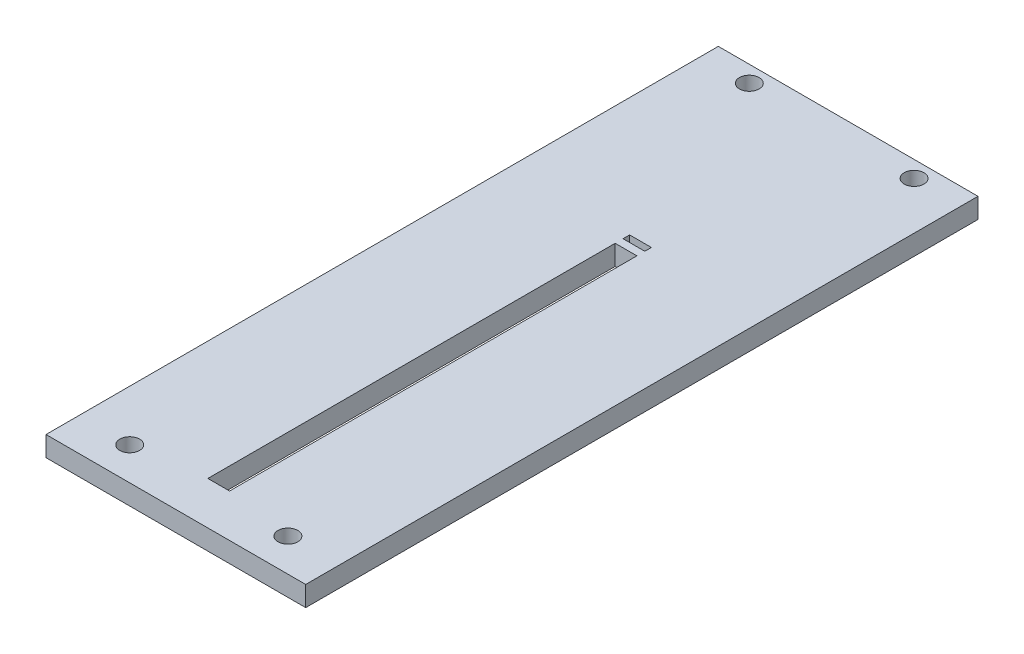
ISO-10303-21;
HEADER;
FILE_DESCRIPTION(('STEP AP214'),'2;1');
FILE_NAME('part.step','',(''),(''),'','','');
FILE_SCHEMA(('AUTOMOTIVE_DESIGN { 1 0 10303 214 1 1 1 1 }'));
ENDSEC;
DATA;
#1=APPLICATION_CONTEXT('core data for automotive mechanical design processes');
#2=APPLICATION_PROTOCOL_DEFINITION('international standard','automotive_design',2000,#1);
#3=PRODUCT_CONTEXT('',#1,'mechanical');
#4=PRODUCT('Part','Part','',(#3));
#5=PRODUCT_RELATED_PRODUCT_CATEGORY('part','',(#4));
#6=PRODUCT_DEFINITION_FORMATION('','',#4);
#7=PRODUCT_DEFINITION_CONTEXT('part definition',#1,'design');
#8=PRODUCT_DEFINITION('design','',#6,#7);
#9=PRODUCT_DEFINITION_SHAPE('','',#8);
#10=(LENGTH_UNIT() NAMED_UNIT(*) SI_UNIT(.MILLI.,.METRE.));
#11=(NAMED_UNIT(*) PLANE_ANGLE_UNIT() SI_UNIT($,.RADIAN.));
#12=(NAMED_UNIT(*) SI_UNIT($,.STERADIAN.) SOLID_ANGLE_UNIT());
#13=UNCERTAINTY_MEASURE_WITH_UNIT(LENGTH_MEASURE(1.E-05),#10,'distance_accuracy_value','');
#14=(GEOMETRIC_REPRESENTATION_CONTEXT(3) GLOBAL_UNCERTAINTY_ASSIGNED_CONTEXT((#13)) GLOBAL_UNIT_ASSIGNED_CONTEXT((#10,
#11,#12)) REPRESENTATION_CONTEXT('',''));
#15=CARTESIAN_POINT('',(0.,0.,0.));
#16=DIRECTION('',(0.,0.,1.));
#17=DIRECTION('',(1.,0.,0.));
#18=AXIS2_PLACEMENT_3D('',#15,#16,#17);
#19=CARTESIAN_POINT('',(0.,3.05,0.));
#20=DIRECTION('',(0.,1.,0.));
#21=DIRECTION('',(0.,0.,1.));
#22=AXIS2_PLACEMENT_3D('',#19,#20,#21);
#23=PLANE('',#22);
#24=CARTESIAN_POINT('',(-12.5,3.05,-99.5));
#25=DIRECTION('',(0.,1.,0.));
#26=DIRECTION('',(0.,0.,1.));
#27=AXIS2_PLACEMENT_3D('',#24,#25,#26);
#28=CIRCLE('',#27,1.5);
#29=CARTESIAN_POINT('',(-12.5,3.05,-98.));
#30=VERTEX_POINT('',#29);
#31=EDGE_CURVE('E530',#30,#30,#28,.T.);
#32=ORIENTED_EDGE('',*,*,#31,.F.);
#33=EDGE_LOOP('',(#32));
#34=FACE_BOUND('',#33,.T.);
#35=CARTESIAN_POINT('',(12.5,3.05,-99.5));
#36=DIRECTION('',(0.,1.,0.));
#37=DIRECTION('',(0.,0.,1.));
#38=AXIS2_PLACEMENT_3D('',#35,#36,#37);
#39=CIRCLE('',#38,1.5);
#40=CARTESIAN_POINT('',(12.5,3.05,-98.));
#41=VERTEX_POINT('',#40);
#42=EDGE_CURVE('E534',#41,#41,#39,.T.);
#43=ORIENTED_EDGE('',*,*,#42,.F.);
#44=EDGE_LOOP('',(#43));
#45=FACE_BOUND('',#44,.T.);
#46=CARTESIAN_POINT('',(12.,3.05,-5.));
#47=DIRECTION('',(0.,-1.,0.));
#48=DIRECTION('',(0.,0.,-1.));
#49=AXIS2_PLACEMENT_3D('',#46,#47,#48);
#50=CIRCLE('',#49,1.5);
#51=CARTESIAN_POINT('',(12.,3.05,-6.5));
#52=VERTEX_POINT('',#51);
#53=EDGE_CURVE('E550',#52,#52,#50,.T.);
#54=ORIENTED_EDGE('',*,*,#53,.T.);
#55=EDGE_LOOP('',(#54));
#56=FACE_BOUND('',#55,.T.);
#57=DIRECTION('',(1.,0.,0.));
#58=VECTOR('',#57,1.);
#59=CARTESIAN_POINT('',(0.,3.05,-6.5));
#60=LINE('',#59,#58);
#61=CARTESIAN_POINT('',(-1.65,3.05,-6.5));
#62=VERTEX_POINT('',#61);
#63=CARTESIAN_POINT('',(1.65,3.05,-6.5));
#64=VERTEX_POINT('',#63);
#65=EDGE_CURVE('E85',#62,#64,#60,.T.);
#66=ORIENTED_EDGE('',*,*,#65,.F.);
#67=DIRECTION('',(0.,0.,1.));
#68=VECTOR('',#67,1.);
#69=CARTESIAN_POINT('',(-1.65,3.05,0.));
#70=LINE('',#69,#68);
#71=CARTESIAN_POINT('',(-1.65,3.05,-68.3));
#72=VERTEX_POINT('',#71);
#73=EDGE_CURVE('E183',#72,#62,#70,.T.);
#74=ORIENTED_EDGE('',*,*,#73,.F.);
#75=DIRECTION('',(-1.,0.,0.));
#76=VECTOR('',#75,1.);
#77=CARTESIAN_POINT('',(0.,3.05,-68.3));
#78=LINE('',#77,#76);
#79=CARTESIAN_POINT('',(1.65,3.05,-68.3));
#80=VERTEX_POINT('',#79);
#81=EDGE_CURVE('E187',#80,#72,#78,.T.);
#82=ORIENTED_EDGE('',*,*,#81,.F.);
#83=DIRECTION('',(0.,0.,-1.));
#84=VECTOR('',#83,1.);
#85=CARTESIAN_POINT('',(1.65,3.05,0.));
#86=LINE('',#85,#84);
#87=EDGE_CURVE('E199',#64,#80,#86,.T.);
#88=ORIENTED_EDGE('',*,*,#87,.F.);
#89=EDGE_LOOP('',(#66,#74,#82,#88));
#90=FACE_BOUND('',#89,.T.);
#91=DIRECTION('',(0.,0.,-1.));
#92=VECTOR('',#91,1.);
#93=CARTESIAN_POINT('',(1.65,3.05,0.));
#94=LINE('',#93,#92);
#95=CARTESIAN_POINT('',(1.65,3.05,-69.5));
#96=VERTEX_POINT('',#95);
#97=CARTESIAN_POINT('',(1.65,3.05,-70.5));
#98=VERTEX_POINT('',#97);
#99=EDGE_CURVE('E236',#96,#98,#94,.T.);
#100=ORIENTED_EDGE('',*,*,#99,.F.);
#101=DIRECTION('',(1.,0.,0.));
#102=VECTOR('',#101,1.);
#103=CARTESIAN_POINT('',(0.,3.05,-69.5));
#104=LINE('',#103,#102);
#105=CARTESIAN_POINT('',(-1.65,3.05,-69.5));
#106=VERTEX_POINT('',#105);
#107=EDGE_CURVE('E200',#106,#96,#104,.T.);
#108=ORIENTED_EDGE('',*,*,#107,.F.);
#109=DIRECTION('',(0.,0.,1.));
#110=VECTOR('',#109,1.);
#111=CARTESIAN_POINT('',(-1.65,3.05,0.));
#112=LINE('',#111,#110);
#113=CARTESIAN_POINT('',(-1.65,3.05,-70.5));
#114=VERTEX_POINT('',#113);
#115=EDGE_CURVE('E93',#114,#106,#112,.T.);
#116=ORIENTED_EDGE('',*,*,#115,.F.);
#117=DIRECTION('',(-1.,0.,0.));
#118=VECTOR('',#117,1.);
#119=CARTESIAN_POINT('',(0.,3.05,-70.5));
#120=LINE('',#119,#118);
#121=EDGE_CURVE('E231',#98,#114,#120,.T.);
#122=ORIENTED_EDGE('',*,*,#121,.F.);
#123=EDGE_LOOP('',(#100,#108,#116,#122));
#124=FACE_BOUND('',#123,.T.);
#125=DIRECTION('',(1.,0.,0.));
#126=VECTOR('',#125,1.);
#127=CARTESIAN_POINT('',(0.,3.05,0.));
#128=LINE('',#127,#126);
#129=CARTESIAN_POINT('',(-19.7,3.05,0.));
#130=VERTEX_POINT('',#129);
#131=CARTESIAN_POINT('',(19.7,3.05,0.));
#132=VERTEX_POINT('',#131);
#133=EDGE_CURVE('E257',#130,#132,#128,.T.);
#134=ORIENTED_EDGE('',*,*,#133,.T.);
#135=DIRECTION('',(0.,0.,-1.));
#136=VECTOR('',#135,1.);
#137=CARTESIAN_POINT('',(19.7,3.05,0.));
#138=LINE('',#137,#136);
#139=CARTESIAN_POINT('',(19.7,3.05,-102.));
#140=VERTEX_POINT('',#139);
#141=EDGE_CURVE('E261',#132,#140,#138,.T.);
#142=ORIENTED_EDGE('',*,*,#141,.T.);
#143=DIRECTION('',(1.,0.,0.));
#144=VECTOR('',#143,1.);
#145=CARTESIAN_POINT('',(0.,3.05,-102.));
#146=LINE('',#145,#144);
#147=CARTESIAN_POINT('',(-19.7,3.05,-102.));
#148=VERTEX_POINT('',#147);
#149=EDGE_CURVE('E265',#148,#140,#146,.T.);
#150=ORIENTED_EDGE('',*,*,#149,.F.);
#151=DIRECTION('',(0.,0.,-1.));
#152=VECTOR('',#151,1.);
#153=CARTESIAN_POINT('',(-19.7,3.05,0.));
#154=LINE('',#153,#152);
#155=EDGE_CURVE('E269',#130,#148,#154,.T.);
#156=ORIENTED_EDGE('',*,*,#155,.F.);
#157=EDGE_LOOP('',(#134,#142,#150,#156));
#158=FACE_BOUND('',#157,.T.);
#159=CARTESIAN_POINT('',(-12.,3.05,-5.));
#160=DIRECTION('',(0.,1.,0.));
#161=DIRECTION('',(0.,0.,1.));
#162=AXIS2_PLACEMENT_3D('',#159,#160,#161);
#163=CIRCLE('',#162,1.5);
#164=CARTESIAN_POINT('',(-12.,3.05,-3.5));
#165=VERTEX_POINT('',#164);
#166=EDGE_CURVE('E547',#165,#165,#163,.T.);
#167=ORIENTED_EDGE('',*,*,#166,.F.);
#168=EDGE_LOOP('',(#167));
#169=FACE_BOUND('',#168,.T.);
#170=ADVANCED_FACE('F69',(#34,#45,#56,#90,#124,#158,#169),#23,.T.);
#171=CARTESIAN_POINT('',(0.,0.,0.));
#172=DIRECTION('',(0.,1.,0.));
#173=DIRECTION('',(0.,0.,1.));
#174=AXIS2_PLACEMENT_3D('',#171,#172,#173);
#175=PLANE('',#174);
#176=CARTESIAN_POINT('',(-12.5,0.,-99.5));
#177=DIRECTION('',(0.,1.,0.));
#178=DIRECTION('',(0.,0.,1.));
#179=AXIS2_PLACEMENT_3D('',#176,#177,#178);
#180=CIRCLE('',#179,1.5);
#181=CARTESIAN_POINT('',(-12.5,0.,-98.));
#182=VERTEX_POINT('',#181);
#183=EDGE_CURVE('E528',#182,#182,#180,.T.);
#184=ORIENTED_EDGE('',*,*,#183,.T.);
#185=EDGE_LOOP('',(#184));
#186=FACE_BOUND('',#185,.T.);
#187=CARTESIAN_POINT('',(12.5,0.,-99.5));
#188=DIRECTION('',(0.,1.,0.));
#189=DIRECTION('',(0.,0.,1.));
#190=AXIS2_PLACEMENT_3D('',#187,#188,#189);
#191=CIRCLE('',#190,1.5);
#192=CARTESIAN_POINT('',(12.5,0.,-98.));
#193=VERTEX_POINT('',#192);
#194=EDGE_CURVE('E540',#193,#193,#191,.T.);
#195=ORIENTED_EDGE('',*,*,#194,.T.);
#196=EDGE_LOOP('',(#195));
#197=FACE_BOUND('',#196,.T.);
#198=DIRECTION('',(1.,0.,0.));
#199=VECTOR('',#198,1.);
#200=CARTESIAN_POINT('',(0.,0.,0.));
#201=LINE('',#200,#199);
#202=CARTESIAN_POINT('',(-19.7,0.,0.));
#203=VERTEX_POINT('',#202);
#204=CARTESIAN_POINT('',(19.7,0.,0.));
#205=VERTEX_POINT('',#204);
#206=EDGE_CURVE('E209',#203,#205,#201,.T.);
#207=ORIENTED_EDGE('',*,*,#206,.F.);
#208=DIRECTION('',(0.,0.,-1.));
#209=VECTOR('',#208,1.);
#210=CARTESIAN_POINT('',(-19.7,0.,0.));
#211=LINE('',#210,#209);
#212=CARTESIAN_POINT('',(-19.7,0.,-102.));
#213=VERTEX_POINT('',#212);
#214=EDGE_CURVE('E262',#203,#213,#211,.T.);
#215=ORIENTED_EDGE('',*,*,#214,.T.);
#216=DIRECTION('',(1.,0.,0.));
#217=VECTOR('',#216,1.);
#218=CARTESIAN_POINT('',(0.,0.,-102.));
#219=LINE('',#218,#217);
#220=CARTESIAN_POINT('',(19.7,0.,-102.));
#221=VERTEX_POINT('',#220);
#222=EDGE_CURVE('E281',#213,#221,#219,.T.);
#223=ORIENTED_EDGE('',*,*,#222,.T.);
#224=DIRECTION('',(0.,0.,-1.));
#225=VECTOR('',#224,1.);
#226=CARTESIAN_POINT('',(19.7,0.,0.));
#227=LINE('',#226,#225);
#228=EDGE_CURVE('E277',#205,#221,#227,.T.);
#229=ORIENTED_EDGE('',*,*,#228,.F.);
#230=EDGE_LOOP('',(#207,#215,#223,#229));
#231=FACE_BOUND('',#230,.T.);
#232=DIRECTION('',(1.,0.,0.));
#233=VECTOR('',#232,1.);
#234=CARTESIAN_POINT('',(0.,0.,-69.5));
#235=LINE('',#234,#233);
#236=CARTESIAN_POINT('',(-1.65,0.,-69.5));
#237=VERTEX_POINT('',#236);
#238=CARTESIAN_POINT('',(1.65,0.,-69.5));
#239=VERTEX_POINT('',#238);
#240=EDGE_CURVE('E232',#237,#239,#235,.T.);
#241=ORIENTED_EDGE('',*,*,#240,.T.);
#242=DIRECTION('',(0.,0.,-1.));
#243=VECTOR('',#242,1.);
#244=CARTESIAN_POINT('',(1.65,0.,0.));
#245=LINE('',#244,#243);
#246=CARTESIAN_POINT('',(1.65,0.,-70.5));
#247=VERTEX_POINT('',#246);
#248=EDGE_CURVE('E250',#239,#247,#245,.T.);
#249=ORIENTED_EDGE('',*,*,#248,.T.);
#250=DIRECTION('',(-1.,0.,0.));
#251=VECTOR('',#250,1.);
#252=CARTESIAN_POINT('',(0.,0.,-70.5));
#253=LINE('',#252,#251);
#254=CARTESIAN_POINT('',(-1.65,0.,-70.5));
#255=VERTEX_POINT('',#254);
#256=EDGE_CURVE('E246',#247,#255,#253,.T.);
#257=ORIENTED_EDGE('',*,*,#256,.T.);
#258=DIRECTION('',(0.,0.,1.));
#259=VECTOR('',#258,1.);
#260=CARTESIAN_POINT('',(-1.65,0.,0.));
#261=LINE('',#260,#259);
#262=EDGE_CURVE('E218',#255,#237,#261,.T.);
#263=ORIENTED_EDGE('',*,*,#262,.T.);
#264=EDGE_LOOP('',(#241,#249,#257,#263));
#265=FACE_BOUND('',#264,.T.);
#266=DIRECTION('',(0.,0.,1.));
#267=VECTOR('',#266,1.);
#268=CARTESIAN_POINT('',(-1.65,0.,0.));
#269=LINE('',#268,#267);
#270=CARTESIAN_POINT('',(-1.65,0.,-68.3));
#271=VERTEX_POINT('',#270);
#272=CARTESIAN_POINT('',(-1.65,0.,-6.5));
#273=VERTEX_POINT('',#272);
#274=EDGE_CURVE('E168',#271,#273,#269,.T.);
#275=ORIENTED_EDGE('',*,*,#274,.T.);
#276=DIRECTION('',(1.,0.,0.));
#277=VECTOR('',#276,1.);
#278=CARTESIAN_POINT('',(0.,0.,-6.5));
#279=LINE('',#278,#277);
#280=CARTESIAN_POINT('',(1.65,0.,-6.5));
#281=VERTEX_POINT('',#280);
#282=EDGE_CURVE('E161',#273,#281,#279,.T.);
#283=ORIENTED_EDGE('',*,*,#282,.T.);
#284=DIRECTION('',(0.,0.,-1.));
#285=VECTOR('',#284,1.);
#286=CARTESIAN_POINT('',(1.65,0.,0.));
#287=LINE('',#286,#285);
#288=CARTESIAN_POINT('',(1.65,0.,-68.3));
#289=VERTEX_POINT('',#288);
#290=EDGE_CURVE('E172',#281,#289,#287,.T.);
#291=ORIENTED_EDGE('',*,*,#290,.T.);
#292=DIRECTION('',(-1.,0.,0.));
#293=VECTOR('',#292,1.);
#294=CARTESIAN_POINT('',(0.,0.,-68.3));
#295=LINE('',#294,#293);
#296=EDGE_CURVE('E177',#289,#271,#295,.T.);
#297=ORIENTED_EDGE('',*,*,#296,.T.);
#298=EDGE_LOOP('',(#275,#283,#291,#297));
#299=FACE_BOUND('',#298,.T.);
#300=CARTESIAN_POINT('',(12.,0.,-5.));
#301=DIRECTION('',(0.,-1.,0.));
#302=DIRECTION('',(0.,0.,-1.));
#303=AXIS2_PLACEMENT_3D('',#300,#301,#302);
#304=CIRCLE('',#303,1.5);
#305=CARTESIAN_POINT('',(12.,0.,-6.5));
#306=VERTEX_POINT('',#305);
#307=EDGE_CURVE('E190',#306,#306,#304,.T.);
#308=ORIENTED_EDGE('',*,*,#307,.F.);
#309=EDGE_LOOP('',(#308));
#310=FACE_BOUND('',#309,.T.);
#311=CARTESIAN_POINT('',(-12.,0.,-5.));
#312=DIRECTION('',(0.,1.,0.));
#313=DIRECTION('',(0.,0.,1.));
#314=AXIS2_PLACEMENT_3D('',#311,#312,#313);
#315=CIRCLE('',#314,1.5);
#316=CARTESIAN_POINT('',(-12.,0.,-3.5));
#317=VERTEX_POINT('',#316);
#318=EDGE_CURVE('E228',#317,#317,#315,.T.);
#319=ORIENTED_EDGE('',*,*,#318,.T.);
#320=EDGE_LOOP('',(#319));
#321=FACE_BOUND('',#320,.T.);
#322=ADVANCED_FACE('F179',(#186,#197,#231,#265,#299,#310,#321),#175,.F.);
#323=CARTESIAN_POINT('',(0.,3.05,0.));
#324=DIRECTION('',(0.,0.,-1.));
#325=DIRECTION('',(-1.,0.,0.));
#326=AXIS2_PLACEMENT_3D('',#323,#324,#325);
#327=PLANE('',#326);
#328=ORIENTED_EDGE('',*,*,#206,.T.);
#329=DIRECTION('',(0.,-1.,0.));
#330=VECTOR('',#329,1.);
#331=CARTESIAN_POINT('',(19.7,3.05,0.));
#332=LINE('',#331,#330);
#333=EDGE_CURVE('E12',#132,#205,#332,.T.);
#334=ORIENTED_EDGE('',*,*,#333,.F.);
#335=ORIENTED_EDGE('',*,*,#133,.F.);
#336=DIRECTION('',(0.,-1.,0.));
#337=VECTOR('',#336,1.);
#338=CARTESIAN_POINT('',(-19.7,3.05,0.));
#339=LINE('',#338,#337);
#340=EDGE_CURVE('E273',#130,#203,#339,.T.);
#341=ORIENTED_EDGE('',*,*,#340,.T.);
#342=EDGE_LOOP('',(#328,#334,#335,#341));
#343=FACE_BOUND('',#342,.T.);
#344=ADVANCED_FACE('F71',(#343),#327,.F.);
#345=CARTESIAN_POINT('',(19.7,3.05,0.));
#346=DIRECTION('',(-1.,0.,0.));
#347=DIRECTION('',(0.,0.,1.));
#348=AXIS2_PLACEMENT_3D('',#345,#346,#347);
#349=PLANE('',#348);
#350=ORIENTED_EDGE('',*,*,#228,.T.);
#351=DIRECTION('',(0.,-1.,0.));
#352=VECTOR('',#351,1.);
#353=CARTESIAN_POINT('',(19.7,3.05,-102.));
#354=LINE('',#353,#352);
#355=EDGE_CURVE('E78',#140,#221,#354,.T.);
#356=ORIENTED_EDGE('',*,*,#355,.F.);
#357=ORIENTED_EDGE('',*,*,#141,.F.);
#358=ORIENTED_EDGE('',*,*,#333,.T.);
#359=EDGE_LOOP('',(#350,#356,#357,#358));
#360=FACE_BOUND('',#359,.T.);
#361=ADVANCED_FACE('F299',(#360),#349,.F.);
#362=CARTESIAN_POINT('',(0.,3.05,-102.));
#363=DIRECTION('',(0.,0.,-1.));
#364=DIRECTION('',(-1.,0.,0.));
#365=AXIS2_PLACEMENT_3D('',#362,#363,#364);
#366=PLANE('',#365);
#367=ORIENTED_EDGE('',*,*,#222,.F.);
#368=DIRECTION('',(0.,-1.,0.));
#369=VECTOR('',#368,1.);
#370=CARTESIAN_POINT('',(-19.7,3.05,-102.));
#371=LINE('',#370,#369);
#372=EDGE_CURVE('E290',#148,#213,#371,.T.);
#373=ORIENTED_EDGE('',*,*,#372,.F.);
#374=ORIENTED_EDGE('',*,*,#149,.T.);
#375=ORIENTED_EDGE('',*,*,#355,.T.);
#376=EDGE_LOOP('',(#367,#373,#374,#375));
#377=FACE_BOUND('',#376,.T.);
#378=ADVANCED_FACE('F296',(#377),#366,.T.);
#379=CARTESIAN_POINT('',(-19.7,3.05,0.));
#380=DIRECTION('',(-1.,0.,0.));
#381=DIRECTION('',(0.,0.,1.));
#382=AXIS2_PLACEMENT_3D('',#379,#380,#381);
#383=PLANE('',#382);
#384=ORIENTED_EDGE('',*,*,#214,.F.);
#385=ORIENTED_EDGE('',*,*,#340,.F.);
#386=ORIENTED_EDGE('',*,*,#155,.T.);
#387=ORIENTED_EDGE('',*,*,#372,.T.);
#388=EDGE_LOOP('',(#384,#385,#386,#387));
#389=FACE_BOUND('',#388,.T.);
#390=ADVANCED_FACE('F306',(#389),#383,.T.);
#391=CARTESIAN_POINT('',(1.65,0.,0.));
#392=DIRECTION('',(1.,0.,0.));
#393=DIRECTION('',(0.,0.,-1.));
#394=AXIS2_PLACEMENT_3D('',#391,#392,#393);
#395=PLANE('',#394);
#396=ORIENTED_EDGE('',*,*,#99,.T.);
#397=DIRECTION('',(0.,1.,0.));
#398=VECTOR('',#397,1.);
#399=CARTESIAN_POINT('',(1.65,0.,-70.5));
#400=LINE('',#399,#398);
#401=EDGE_CURVE('E219',#247,#98,#400,.T.);
#402=ORIENTED_EDGE('',*,*,#401,.F.);
#403=ORIENTED_EDGE('',*,*,#248,.F.);
#404=DIRECTION('',(0.,1.,0.));
#405=VECTOR('',#404,1.);
#406=CARTESIAN_POINT('',(1.65,0.,-69.5));
#407=LINE('',#406,#405);
#408=EDGE_CURVE('E215',#239,#96,#407,.T.);
#409=ORIENTED_EDGE('',*,*,#408,.T.);
#410=EDGE_LOOP('',(#396,#402,#403,#409));
#411=FACE_BOUND('',#410,.T.);
#412=ADVANCED_FACE('F332',(#411),#395,.F.);
#413=CARTESIAN_POINT('',(0.,0.,-70.5));
#414=DIRECTION('',(0.,0.,-1.));
#415=DIRECTION('',(-1.,0.,0.));
#416=AXIS2_PLACEMENT_3D('',#413,#414,#415);
#417=PLANE('',#416);
#418=ORIENTED_EDGE('',*,*,#121,.T.);
#419=DIRECTION('',(0.,1.,0.));
#420=VECTOR('',#419,1.);
#421=CARTESIAN_POINT('',(-1.65,0.,-70.5));
#422=LINE('',#421,#420);
#423=EDGE_CURVE('E222',#255,#114,#422,.T.);
#424=ORIENTED_EDGE('',*,*,#423,.F.);
#425=ORIENTED_EDGE('',*,*,#256,.F.);
#426=ORIENTED_EDGE('',*,*,#401,.T.);
#427=EDGE_LOOP('',(#418,#424,#425,#426));
#428=FACE_BOUND('',#427,.T.);
#429=ADVANCED_FACE('F348',(#428),#417,.F.);
#430=CARTESIAN_POINT('',(-1.65,0.,0.));
#431=DIRECTION('',(-1.,0.,0.));
#432=DIRECTION('',(0.,0.,1.));
#433=AXIS2_PLACEMENT_3D('',#430,#431,#432);
#434=PLANE('',#433);
#435=ORIENTED_EDGE('',*,*,#115,.T.);
#436=DIRECTION('',(0.,1.,0.));
#437=VECTOR('',#436,1.);
#438=CARTESIAN_POINT('',(-1.65,0.,-69.5));
#439=LINE('',#438,#437);
#440=EDGE_CURVE('E225',#237,#106,#439,.T.);
#441=ORIENTED_EDGE('',*,*,#440,.F.);
#442=ORIENTED_EDGE('',*,*,#262,.F.);
#443=ORIENTED_EDGE('',*,*,#423,.T.);
#444=EDGE_LOOP('',(#435,#441,#442,#443));
#445=FACE_BOUND('',#444,.T.);
#446=ADVANCED_FACE('F327',(#445),#434,.F.);
#447=CARTESIAN_POINT('',(0.,0.,-69.5));
#448=DIRECTION('',(0.,0.,1.));
#449=DIRECTION('',(1.,0.,0.));
#450=AXIS2_PLACEMENT_3D('',#447,#448,#449);
#451=PLANE('',#450);
#452=ORIENTED_EDGE('',*,*,#107,.T.);
#453=ORIENTED_EDGE('',*,*,#408,.F.);
#454=ORIENTED_EDGE('',*,*,#240,.F.);
#455=ORIENTED_EDGE('',*,*,#440,.T.);
#456=EDGE_LOOP('',(#452,#453,#454,#455));
#457=FACE_BOUND('',#456,.T.);
#458=ADVANCED_FACE('F362',(#457),#451,.F.);
#459=CARTESIAN_POINT('',(0.,0.,-6.5));
#460=DIRECTION('',(0.,0.,1.));
#461=DIRECTION('',(1.,0.,0.));
#462=AXIS2_PLACEMENT_3D('',#459,#460,#461);
#463=PLANE('',#462);
#464=ORIENTED_EDGE('',*,*,#65,.T.);
#465=DIRECTION('',(0.,1.,0.));
#466=VECTOR('',#465,1.);
#467=CARTESIAN_POINT('',(1.65,0.,-6.5));
#468=LINE('',#467,#466);
#469=EDGE_CURVE('E157',#281,#64,#468,.T.);
#470=ORIENTED_EDGE('',*,*,#469,.F.);
#471=ORIENTED_EDGE('',*,*,#282,.F.);
#472=DIRECTION('',(0.,1.,0.));
#473=VECTOR('',#472,1.);
#474=CARTESIAN_POINT('',(-1.65,0.,-6.5));
#475=LINE('',#474,#473);
#476=EDGE_CURVE('E206',#273,#62,#475,.T.);
#477=ORIENTED_EDGE('',*,*,#476,.T.);
#478=EDGE_LOOP('',(#464,#470,#471,#477));
#479=FACE_BOUND('',#478,.T.);
#480=ADVANCED_FACE('F159',(#479),#463,.F.);
#481=CARTESIAN_POINT('',(-1.65,0.,0.));
#482=DIRECTION('',(-1.,0.,0.));
#483=DIRECTION('',(0.,0.,1.));
#484=AXIS2_PLACEMENT_3D('',#481,#482,#483);
#485=PLANE('',#484);
#486=ORIENTED_EDGE('',*,*,#73,.T.);
#487=ORIENTED_EDGE('',*,*,#476,.F.);
#488=ORIENTED_EDGE('',*,*,#274,.F.);
#489=DIRECTION('',(0.,1.,0.));
#490=VECTOR('',#489,1.);
#491=CARTESIAN_POINT('',(-1.65,0.,-68.3));
#492=LINE('',#491,#490);
#493=EDGE_CURVE('E210',#271,#72,#492,.T.);
#494=ORIENTED_EDGE('',*,*,#493,.T.);
#495=EDGE_LOOP('',(#486,#487,#488,#494));
#496=FACE_BOUND('',#495,.T.);
#497=ADVANCED_FACE('F375',(#496),#485,.F.);
#498=CARTESIAN_POINT('',(0.,0.,-68.3));
#499=DIRECTION('',(0.,0.,-1.));
#500=DIRECTION('',(-1.,0.,0.));
#501=AXIS2_PLACEMENT_3D('',#498,#499,#500);
#502=PLANE('',#501);
#503=ORIENTED_EDGE('',*,*,#81,.T.);
#504=ORIENTED_EDGE('',*,*,#493,.F.);
#505=ORIENTED_EDGE('',*,*,#296,.F.);
#506=DIRECTION('',(0.,1.,0.));
#507=VECTOR('',#506,1.);
#508=CARTESIAN_POINT('',(1.65,0.,-68.3));
#509=LINE('',#508,#507);
#510=EDGE_CURVE('E167',#289,#80,#509,.T.);
#511=ORIENTED_EDGE('',*,*,#510,.T.);
#512=EDGE_LOOP('',(#503,#504,#505,#511));
#513=FACE_BOUND('',#512,.T.);
#514=ADVANCED_FACE('F382',(#513),#502,.F.);
#515=CARTESIAN_POINT('',(1.65,0.,0.));
#516=DIRECTION('',(1.,0.,0.));
#517=DIRECTION('',(0.,0.,-1.));
#518=AXIS2_PLACEMENT_3D('',#515,#516,#517);
#519=PLANE('',#518);
#520=ORIENTED_EDGE('',*,*,#87,.T.);
#521=ORIENTED_EDGE('',*,*,#510,.F.);
#522=ORIENTED_EDGE('',*,*,#290,.F.);
#523=ORIENTED_EDGE('',*,*,#469,.T.);
#524=EDGE_LOOP('',(#520,#521,#522,#523));
#525=FACE_BOUND('',#524,.T.);
#526=ADVANCED_FACE('F173',(#525),#519,.F.);
#527=CARTESIAN_POINT('',(12.,0.,-5.));
#528=DIRECTION('',(0.,1.,0.));
#529=DIRECTION('',(0.,0.,1.));
#530=AXIS2_PLACEMENT_3D('',#527,#528,#529);
#531=CYLINDRICAL_SURFACE('',#530,1.5);
#532=ORIENTED_EDGE('',*,*,#307,.T.);
#533=EDGE_LOOP('',(#532));
#534=FACE_BOUND('',#533,.T.);
#535=ORIENTED_EDGE('',*,*,#53,.F.);
#536=EDGE_LOOP('',(#535));
#537=FACE_BOUND('',#536,.T.);
#538=ADVANCED_FACE('F397',(#534,#537),#531,.F.);
#539=CARTESIAN_POINT('',(-12.,0.,-5.));
#540=DIRECTION('',(0.,1.,0.));
#541=DIRECTION('',(0.,0.,1.));
#542=AXIS2_PLACEMENT_3D('',#539,#540,#541);
#543=CYLINDRICAL_SURFACE('',#542,1.5);
#544=ORIENTED_EDGE('',*,*,#318,.F.);
#545=EDGE_LOOP('',(#544));
#546=FACE_BOUND('',#545,.T.);
#547=ORIENTED_EDGE('',*,*,#166,.T.);
#548=EDGE_LOOP('',(#547));
#549=FACE_BOUND('',#548,.T.);
#550=ADVANCED_FACE('F404',(#546,#549),#543,.F.);
#551=CARTESIAN_POINT('',(12.5,3.05,-99.5));
#552=DIRECTION('',(0.,1.,0.));
#553=DIRECTION('',(0.,0.,1.));
#554=AXIS2_PLACEMENT_3D('',#551,#552,#553);
#555=CYLINDRICAL_SURFACE('',#554,1.5);
#556=ORIENTED_EDGE('',*,*,#194,.F.);
#557=EDGE_LOOP('',(#556));
#558=FACE_BOUND('',#557,.T.);
#559=ORIENTED_EDGE('',*,*,#42,.T.);
#560=EDGE_LOOP('',(#559));
#561=FACE_BOUND('',#560,.T.);
#562=ADVANCED_FACE('F412',(#558,#561),#555,.F.);
#563=CARTESIAN_POINT('',(-12.5,3.05,-99.5));
#564=DIRECTION('',(0.,1.,0.));
#565=DIRECTION('',(0.,0.,1.));
#566=AXIS2_PLACEMENT_3D('',#563,#564,#565);
#567=CYLINDRICAL_SURFACE('',#566,1.5);
#568=ORIENTED_EDGE('',*,*,#183,.F.);
#569=EDGE_LOOP('',(#568));
#570=FACE_BOUND('',#569,.T.);
#571=ORIENTED_EDGE('',*,*,#31,.T.);
#572=EDGE_LOOP('',(#571));
#573=FACE_BOUND('',#572,.T.);
#574=ADVANCED_FACE('F420',(#570,#573),#567,.F.);
#575=CLOSED_SHELL('',(#170,#322,#344,#361,#378,#390,#412,#429,#446,#458,#480,#497,#514,#526,
#538,#550,#562,#574));
#576=MANIFOLD_SOLID_BREP('B2',#575);
#577=ADVANCED_BREP_SHAPE_REPRESENTATION('',(#18,#576),#14);
#578=SHAPE_DEFINITION_REPRESENTATION(#9,#577);
ENDSEC;
END-ISO-10303-21;
